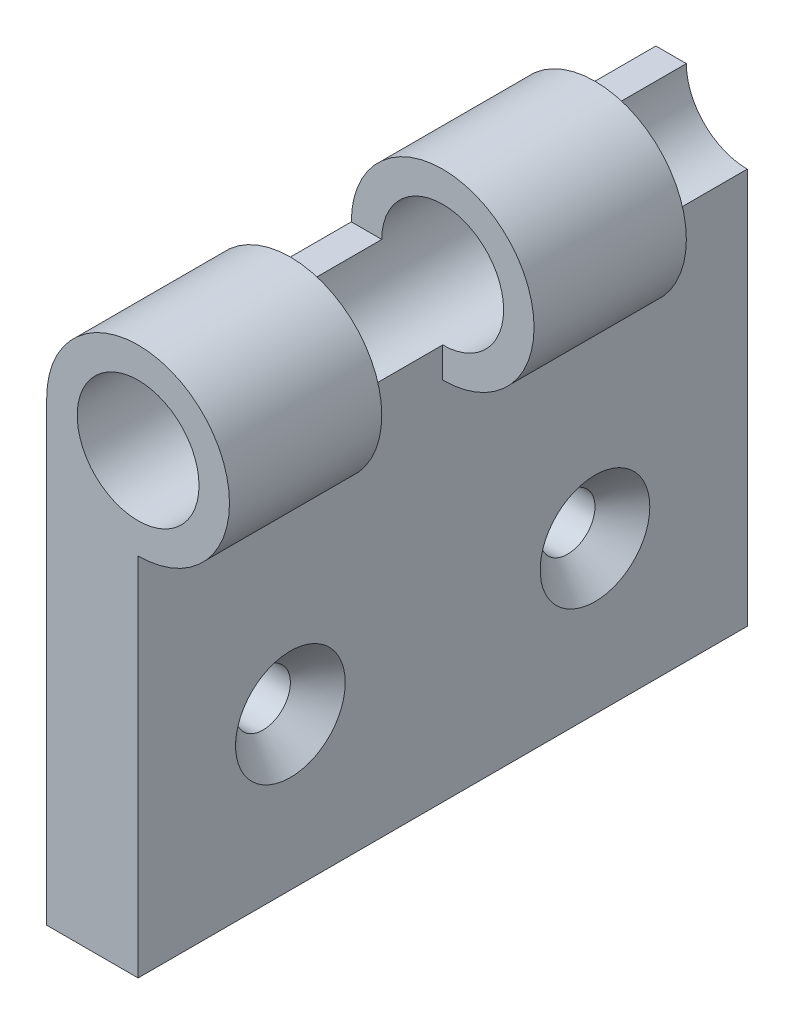
ISO-10303-21;
HEADER;
FILE_DESCRIPTION(('STEP AP214'),'2;1');
FILE_NAME('part.step','',(''),(''),'','','');
FILE_SCHEMA(('AUTOMOTIVE_DESIGN { 1 0 10303 214 1 1 1 1 }'));
ENDSEC;
DATA;
#1=APPLICATION_CONTEXT('core data for automotive mechanical design processes');
#2=APPLICATION_PROTOCOL_DEFINITION('international standard','automotive_design',2000,#1);
#3=PRODUCT_CONTEXT('',#1,'mechanical');
#4=PRODUCT('Part','Part','',(#3));
#5=PRODUCT_RELATED_PRODUCT_CATEGORY('part','',(#4));
#6=PRODUCT_DEFINITION_FORMATION('','',#4);
#7=PRODUCT_DEFINITION_CONTEXT('part definition',#1,'design');
#8=PRODUCT_DEFINITION('design','',#6,#7);
#9=PRODUCT_DEFINITION_SHAPE('','',#8);
#10=(LENGTH_UNIT() NAMED_UNIT(*) SI_UNIT(.MILLI.,.METRE.));
#11=(NAMED_UNIT(*) PLANE_ANGLE_UNIT() SI_UNIT($,.RADIAN.));
#12=(NAMED_UNIT(*) SI_UNIT($,.STERADIAN.) SOLID_ANGLE_UNIT());
#13=UNCERTAINTY_MEASURE_WITH_UNIT(LENGTH_MEASURE(1.E-05),#10,'distance_accuracy_value','');
#14=(GEOMETRIC_REPRESENTATION_CONTEXT(3) GLOBAL_UNCERTAINTY_ASSIGNED_CONTEXT((#13)) GLOBAL_UNIT_ASSIGNED_CONTEXT((#10,
#11,#12)) REPRESENTATION_CONTEXT('',''));
#15=CARTESIAN_POINT('',(0.,0.,0.));
#16=DIRECTION('',(0.,0.,1.));
#17=DIRECTION('',(1.,0.,0.));
#18=AXIS2_PLACEMENT_3D('',#15,#16,#17);
#19=CARTESIAN_POINT('',(0.,0.,-20.));
#20=DIRECTION('',(0.,1.,0.));
#21=DIRECTION('',(0.,0.,1.));
#22=AXIS2_PLACEMENT_3D('',#19,#20,#21);
#23=PLANE('',#22);
#24=DIRECTION('',(0.,0.,1.));
#25=VECTOR('',#24,1.);
#26=CARTESIAN_POINT('',(0.999999999999999,0.,-20.));
#27=LINE('',#26,#25);
#28=CARTESIAN_POINT('',(0.999999999999999,0.,-20.));
#29=VERTEX_POINT('',#28);
#30=CARTESIAN_POINT('',(0.999999999999999,0.,-15.));
#31=VERTEX_POINT('',#30);
#32=EDGE_CURVE('E48',#29,#31,#27,.T.);
#33=ORIENTED_EDGE('',*,*,#32,.F.);
#34=DIRECTION('',(-1.,0.,0.));
#35=VECTOR('',#34,1.);
#36=CARTESIAN_POINT('',(0.,0.,-20.));
#37=LINE('',#36,#35);
#38=CARTESIAN_POINT('',(0.,0.,-20.));
#39=VERTEX_POINT('',#38);
#40=EDGE_CURVE('E124',#29,#39,#37,.T.);
#41=ORIENTED_EDGE('',*,*,#40,.T.);
#42=DIRECTION('',(0.,0.,1.));
#43=VECTOR('',#42,1.);
#44=CARTESIAN_POINT('',(0.,0.,-20.));
#45=LINE('',#44,#43);
#46=CARTESIAN_POINT('',(0.,0.,-15.));
#47=VERTEX_POINT('',#46);
#48=EDGE_CURVE('E154',#39,#47,#45,.T.);
#49=ORIENTED_EDGE('',*,*,#48,.T.);
#50=DIRECTION('',(1.,0.,0.));
#51=VECTOR('',#50,1.);
#52=CARTESIAN_POINT('',(0.,0.,-15.));
#53=LINE('',#52,#51);
#54=EDGE_CURVE('E127',#47,#31,#53,.T.);
#55=ORIENTED_EDGE('',*,*,#54,.T.);
#56=EDGE_LOOP('',(#33,#41,#49,#55));
#57=FACE_BOUND('',#56,.T.);
#58=ADVANCED_FACE('F33',(#57),#23,.T.);
#59=CARTESIAN_POINT('',(3.,0.,-20.));
#60=DIRECTION('',(1.,0.,0.));
#61=DIRECTION('',(0.,1.,0.));
#62=AXIS2_PLACEMENT_3D('',#59,#60,#61);
#63=PLANE('',#62);
#64=CARTESIAN_POINT('',(3.,-10.,-5.));
#65=DIRECTION('',(1.,0.,0.));
#66=DIRECTION('',(0.,0.,-1.));
#67=AXIS2_PLACEMENT_3D('',#64,#65,#66);
#68=CIRCLE('',#67,1.8);
#69=CARTESIAN_POINT('',(3.,-10.,-6.8));
#70=VERTEX_POINT('',#69);
#71=EDGE_CURVE('E273',#70,#70,#68,.T.);
#72=ORIENTED_EDGE('',*,*,#71,.F.);
#73=EDGE_LOOP('',(#72));
#74=FACE_BOUND('',#73,.T.);
#75=CARTESIAN_POINT('',(3.,-10.,-15.));
#76=DIRECTION('',(1.,0.,0.));
#77=DIRECTION('',(0.,0.,-1.));
#78=AXIS2_PLACEMENT_3D('',#75,#76,#77);
#79=CIRCLE('',#78,1.8);
#80=CARTESIAN_POINT('',(3.,-10.,-16.8));
#81=VERTEX_POINT('',#80);
#82=EDGE_CURVE('E264',#81,#81,#79,.T.);
#83=ORIENTED_EDGE('',*,*,#82,.F.);
#84=EDGE_LOOP('',(#83));
#85=FACE_BOUND('',#84,.T.);
#86=DIRECTION('',(0.,0.,1.));
#87=VECTOR('',#86,1.);
#88=CARTESIAN_POINT('',(3.,-2.,-20.));
#89=LINE('',#88,#87);
#90=CARTESIAN_POINT('',(3.,-2.,-5.));
#91=VERTEX_POINT('',#90);
#92=CARTESIAN_POINT('',(3.,-2.,-10.));
#93=VERTEX_POINT('',#92);
#94=EDGE_CURVE('E55',#91,#93,#89,.F.);
#95=ORIENTED_EDGE('',*,*,#94,.F.);
#96=DIRECTION('',(0.,-1.,0.));
#97=VECTOR('',#96,1.);
#98=CARTESIAN_POINT('',(3.,0.,-5.));
#99=LINE('',#98,#97);
#100=CARTESIAN_POINT('',(3.,-3.,-5.));
#101=VERTEX_POINT('',#100);
#102=EDGE_CURVE('E156',#91,#101,#99,.T.);
#103=ORIENTED_EDGE('',*,*,#102,.T.);
#104=DIRECTION('',(0.,0.,1.));
#105=VECTOR('',#104,1.);
#106=CARTESIAN_POINT('',(3.,-3.,-5.));
#107=LINE('',#106,#105);
#108=CARTESIAN_POINT('',(3.,-3.,0.));
#109=VERTEX_POINT('',#108);
#110=EDGE_CURVE('E194',#109,#101,#107,.F.);
#111=ORIENTED_EDGE('',*,*,#110,.F.);
#112=DIRECTION('',(0.,1.,0.));
#113=VECTOR('',#112,1.);
#114=CARTESIAN_POINT('',(3.,0.,0.));
#115=LINE('',#114,#113);
#116=CARTESIAN_POINT('',(3.,-15.,0.));
#117=VERTEX_POINT('',#116);
#118=EDGE_CURVE('E151',#117,#109,#115,.T.);
#119=ORIENTED_EDGE('',*,*,#118,.F.);
#120=DIRECTION('',(0.,0.,1.));
#121=VECTOR('',#120,1.);
#122=CARTESIAN_POINT('',(3.,-15.,-20.));
#123=LINE('',#122,#121);
#124=CARTESIAN_POINT('',(3.,-15.,-20.));
#125=VERTEX_POINT('',#124);
#126=EDGE_CURVE('E138',#125,#117,#123,.T.);
#127=ORIENTED_EDGE('',*,*,#126,.F.);
#128=DIRECTION('',(0.,1.,0.));
#129=VECTOR('',#128,1.);
#130=CARTESIAN_POINT('',(3.,0.,-20.));
#131=LINE('',#130,#129);
#132=CARTESIAN_POINT('',(3.,-2.,-20.));
#133=VERTEX_POINT('',#132);
#134=EDGE_CURVE('E136',#125,#133,#131,.T.);
#135=ORIENTED_EDGE('',*,*,#134,.T.);
#136=CARTESIAN_POINT('',(3.,-2.,-15.));
#137=VERTEX_POINT('',#136);
#138=EDGE_CURVE('E113',#137,#133,#89,.F.);
#139=ORIENTED_EDGE('',*,*,#138,.F.);
#140=DIRECTION('',(0.,-1.,0.));
#141=VECTOR('',#140,1.);
#142=CARTESIAN_POINT('',(3.,0.,-15.));
#143=LINE('',#142,#141);
#144=CARTESIAN_POINT('',(3.,-3.,-15.));
#145=VERTEX_POINT('',#144);
#146=EDGE_CURVE('E41',#137,#145,#143,.T.);
#147=ORIENTED_EDGE('',*,*,#146,.T.);
#148=DIRECTION('',(0.,0.,1.));
#149=VECTOR('',#148,1.);
#150=CARTESIAN_POINT('',(3.,-3.,-15.));
#151=LINE('',#150,#149);
#152=CARTESIAN_POINT('',(3.,-3.,-10.));
#153=VERTEX_POINT('',#152);
#154=EDGE_CURVE('E162',#153,#145,#151,.F.);
#155=ORIENTED_EDGE('',*,*,#154,.F.);
#156=DIRECTION('',(0.,-1.,0.));
#157=VECTOR('',#156,1.);
#158=CARTESIAN_POINT('',(3.,0.,-10.));
#159=LINE('',#158,#157);
#160=EDGE_CURVE('E160',#93,#153,#159,.T.);
#161=ORIENTED_EDGE('',*,*,#160,.F.);
#162=EDGE_LOOP('',(#95,#103,#111,#119,#127,#135,#139,#147,#155,#161));
#163=FACE_BOUND('',#162,.T.);
#164=ADVANCED_FACE('F167',(#74,#85,#163),#63,.T.);
#165=DIRECTION('',(0.,0.,1.));
#166=VECTOR('',#165,1.);
#167=CARTESIAN_POINT('',(0.999999999999999,0.,-20.));
#168=LINE('',#167,#166);
#169=CARTESIAN_POINT('',(0.999999999999999,0.,-10.));
#170=VERTEX_POINT('',#169);
#171=CARTESIAN_POINT('',(0.999999999999999,0.,-5.));
#172=VERTEX_POINT('',#171);
#173=EDGE_CURVE('E118',#170,#172,#168,.T.);
#174=ORIENTED_EDGE('',*,*,#173,.F.);
#175=DIRECTION('',(1.,0.,0.));
#176=VECTOR('',#175,1.);
#177=CARTESIAN_POINT('',(0.,0.,-10.));
#178=LINE('',#177,#176);
#179=CARTESIAN_POINT('',(0.,0.,-10.));
#180=VERTEX_POINT('',#179);
#181=EDGE_CURVE('E180',#180,#170,#178,.T.);
#182=ORIENTED_EDGE('',*,*,#181,.F.);
#183=CARTESIAN_POINT('',(0.,0.,-5.));
#184=VERTEX_POINT('',#183);
#185=EDGE_CURVE('E157',#180,#184,#45,.T.);
#186=ORIENTED_EDGE('',*,*,#185,.T.);
#187=DIRECTION('',(1.,0.,0.));
#188=VECTOR('',#187,1.);
#189=CARTESIAN_POINT('',(0.,0.,-5.));
#190=LINE('',#189,#188);
#191=EDGE_CURVE('E148',#184,#172,#190,.T.);
#192=ORIENTED_EDGE('',*,*,#191,.T.);
#193=EDGE_LOOP('',(#174,#182,#186,#192));
#194=FACE_BOUND('',#193,.T.);
#195=ADVANCED_FACE('F239',(#194),#23,.T.);
#196=CARTESIAN_POINT('',(0.,0.,-20.));
#197=DIRECTION('',(-1.,0.,0.));
#198=DIRECTION('',(0.,-1.,0.));
#199=AXIS2_PLACEMENT_3D('',#196,#197,#198);
#200=PLANE('',#199);
#201=CARTESIAN_POINT('',(0.,-10.,-5.));
#202=DIRECTION('',(1.,0.,0.));
#203=DIRECTION('',(0.,0.,-1.));
#204=AXIS2_PLACEMENT_3D('',#201,#202,#203);
#205=CIRCLE('',#204,0.9);
#206=CARTESIAN_POINT('',(0.,-10.,-5.9));
#207=VERTEX_POINT('',#206);
#208=EDGE_CURVE('E267',#207,#207,#205,.T.);
#209=ORIENTED_EDGE('',*,*,#208,.T.);
#210=EDGE_LOOP('',(#209));
#211=FACE_BOUND('',#210,.T.);
#212=CARTESIAN_POINT('',(0.,-10.,-15.));
#213=DIRECTION('',(1.,0.,0.));
#214=DIRECTION('',(0.,0.,-1.));
#215=AXIS2_PLACEMENT_3D('',#212,#213,#214);
#216=CIRCLE('',#215,0.9);
#217=CARTESIAN_POINT('',(0.,-10.,-15.9));
#218=VERTEX_POINT('',#217);
#219=EDGE_CURVE('E119',#218,#218,#216,.T.);
#220=ORIENTED_EDGE('',*,*,#219,.T.);
#221=EDGE_LOOP('',(#220));
#222=FACE_BOUND('',#221,.T.);
#223=DIRECTION('',(0.,-1.,0.));
#224=VECTOR('',#223,1.);
#225=CARTESIAN_POINT('',(0.,0.,0.));
#226=LINE('',#225,#224);
#227=CARTESIAN_POINT('',(0.,0.,0.));
#228=VERTEX_POINT('',#227);
#229=CARTESIAN_POINT('',(0.,-15.,0.));
#230=VERTEX_POINT('',#229);
#231=EDGE_CURVE('E144',#228,#230,#226,.T.);
#232=ORIENTED_EDGE('',*,*,#231,.F.);
#233=DIRECTION('',(0.,0.,1.));
#234=VECTOR('',#233,1.);
#235=CARTESIAN_POINT('',(0.,0.,-5.));
#236=LINE('',#235,#234);
#237=EDGE_CURVE('E199',#184,#228,#236,.T.);
#238=ORIENTED_EDGE('',*,*,#237,.F.);
#239=ORIENTED_EDGE('',*,*,#185,.F.);
#240=DIRECTION('',(0.,0.,1.));
#241=VECTOR('',#240,1.);
#242=CARTESIAN_POINT('',(0.,0.,-15.));
#243=LINE('',#242,#241);
#244=EDGE_CURVE('E188',#47,#180,#243,.T.);
#245=ORIENTED_EDGE('',*,*,#244,.F.);
#246=ORIENTED_EDGE('',*,*,#48,.F.);
#247=DIRECTION('',(0.,-1.,0.));
#248=VECTOR('',#247,1.);
#249=CARTESIAN_POINT('',(0.,0.,-20.));
#250=LINE('',#249,#248);
#251=CARTESIAN_POINT('',(0.,-15.,-20.));
#252=VERTEX_POINT('',#251);
#253=EDGE_CURVE('E134',#39,#252,#250,.T.);
#254=ORIENTED_EDGE('',*,*,#253,.T.);
#255=DIRECTION('',(0.,0.,1.));
#256=VECTOR('',#255,1.);
#257=CARTESIAN_POINT('',(0.,-15.,-20.));
#258=LINE('',#257,#256);
#259=EDGE_CURVE('E135',#252,#230,#258,.T.);
#260=ORIENTED_EDGE('',*,*,#259,.T.);
#261=EDGE_LOOP('',(#232,#238,#239,#245,#246,#254,#260));
#262=FACE_BOUND('',#261,.T.);
#263=ADVANCED_FACE('F35',(#211,#222,#262),#200,.T.);
#264=CARTESIAN_POINT('',(0.,-15.,-20.));
#265=DIRECTION('',(0.,-1.,0.));
#266=DIRECTION('',(0.,0.,-1.));
#267=AXIS2_PLACEMENT_3D('',#264,#265,#266);
#268=PLANE('',#267);
#269=DIRECTION('',(1.,0.,0.));
#270=VECTOR('',#269,1.);
#271=CARTESIAN_POINT('',(0.,-15.,0.));
#272=LINE('',#271,#270);
#273=EDGE_CURVE('E147',#230,#117,#272,.T.);
#274=ORIENTED_EDGE('',*,*,#273,.F.);
#275=ORIENTED_EDGE('',*,*,#259,.F.);
#276=DIRECTION('',(1.,0.,0.));
#277=VECTOR('',#276,1.);
#278=CARTESIAN_POINT('',(0.,-15.,-20.));
#279=LINE('',#278,#277);
#280=EDGE_CURVE('E140',#252,#125,#279,.T.);
#281=ORIENTED_EDGE('',*,*,#280,.T.);
#282=ORIENTED_EDGE('',*,*,#126,.T.);
#283=EDGE_LOOP('',(#274,#275,#281,#282));
#284=FACE_BOUND('',#283,.T.);
#285=ADVANCED_FACE('F206',(#284),#268,.T.);
#286=CARTESIAN_POINT('',(0.,0.,-20.));
#287=DIRECTION('',(0.,0.,1.));
#288=DIRECTION('',(1.,0.,0.));
#289=AXIS2_PLACEMENT_3D('',#286,#287,#288);
#290=PLANE('',#289);
#291=ORIENTED_EDGE('',*,*,#40,.F.);
#292=CARTESIAN_POINT('',(3.,0.,-20.));
#293=DIRECTION('',(0.,0.,1.));
#294=DIRECTION('',(1.,0.,0.));
#295=AXIS2_PLACEMENT_3D('',#292,#293,#294);
#296=CIRCLE('',#295,2.);
#297=EDGE_CURVE('E110',#29,#133,#296,.T.);
#298=ORIENTED_EDGE('',*,*,#297,.T.);
#299=ORIENTED_EDGE('',*,*,#134,.F.);
#300=ORIENTED_EDGE('',*,*,#280,.F.);
#301=ORIENTED_EDGE('',*,*,#253,.F.);
#302=EDGE_LOOP('',(#291,#298,#299,#300,#301));
#303=FACE_BOUND('',#302,.T.);
#304=ADVANCED_FACE('F131',(#303),#290,.F.);
#305=CARTESIAN_POINT('',(0.,0.,0.));
#306=DIRECTION('',(0.,0.,1.));
#307=DIRECTION('',(1.,0.,0.));
#308=AXIS2_PLACEMENT_3D('',#305,#306,#307);
#309=PLANE('',#308);
#310=CARTESIAN_POINT('',(3.,0.,0.));
#311=DIRECTION('',(0.,0.,1.));
#312=DIRECTION('',(1.,0.,0.));
#313=AXIS2_PLACEMENT_3D('',#310,#311,#312);
#314=CIRCLE('',#313,2.);
#315=CARTESIAN_POINT('',(5.,0.,0.));
#316=VERTEX_POINT('',#315);
#317=EDGE_CURVE('E128',#316,#316,#314,.T.);
#318=ORIENTED_EDGE('',*,*,#317,.F.);
#319=EDGE_LOOP('',(#318));
#320=FACE_BOUND('',#319,.T.);
#321=CARTESIAN_POINT('',(3.,0.,0.));
#322=DIRECTION('',(0.,0.,1.));
#323=DIRECTION('',(1.,0.,0.));
#324=AXIS2_PLACEMENT_3D('',#321,#322,#323);
#325=CIRCLE('',#324,3.);
#326=EDGE_CURVE('E190',#109,#228,#325,.T.);
#327=ORIENTED_EDGE('',*,*,#326,.T.);
#328=ORIENTED_EDGE('',*,*,#231,.T.);
#329=ORIENTED_EDGE('',*,*,#273,.T.);
#330=ORIENTED_EDGE('',*,*,#118,.T.);
#331=EDGE_LOOP('',(#327,#328,#329,#330));
#332=FACE_BOUND('',#331,.T.);
#333=ADVANCED_FACE('F226',(#320,#332),#309,.T.);
#334=CARTESIAN_POINT('',(3.,0.,-5.));
#335=DIRECTION('',(0.,0.,1.));
#336=DIRECTION('',(1.,0.,0.));
#337=AXIS2_PLACEMENT_3D('',#334,#335,#336);
#338=CYLINDRICAL_SURFACE('',#337,3.);
#339=CARTESIAN_POINT('',(3.,0.,-5.));
#340=DIRECTION('',(0.,0.,1.));
#341=DIRECTION('',(1.,0.,0.));
#342=AXIS2_PLACEMENT_3D('',#339,#340,#341);
#343=CIRCLE('',#342,3.);
#344=EDGE_CURVE('E191',#101,#184,#343,.T.);
#345=ORIENTED_EDGE('',*,*,#344,.T.);
#346=ORIENTED_EDGE('',*,*,#237,.T.);
#347=ORIENTED_EDGE('',*,*,#326,.F.);
#348=ORIENTED_EDGE('',*,*,#110,.T.);
#349=EDGE_LOOP('',(#345,#346,#347,#348));
#350=FACE_BOUND('',#349,.T.);
#351=ADVANCED_FACE('F224',(#350),#338,.T.);
#352=CARTESIAN_POINT('',(3.,0.,-5.));
#353=DIRECTION('',(0.,0.,1.));
#354=DIRECTION('',(1.,0.,0.));
#355=AXIS2_PLACEMENT_3D('',#352,#353,#354);
#356=PLANE('',#355);
#357=ORIENTED_EDGE('',*,*,#102,.F.);
#358=CARTESIAN_POINT('',(3.,0.,-5.));
#359=DIRECTION('',(0.,0.,1.));
#360=DIRECTION('',(1.,0.,0.));
#361=AXIS2_PLACEMENT_3D('',#358,#359,#360);
#362=CIRCLE('',#361,2.);
#363=EDGE_CURVE('E216',#91,#172,#362,.T.);
#364=ORIENTED_EDGE('',*,*,#363,.T.);
#365=ORIENTED_EDGE('',*,*,#191,.F.);
#366=ORIENTED_EDGE('',*,*,#344,.F.);
#367=EDGE_LOOP('',(#357,#364,#365,#366));
#368=FACE_BOUND('',#367,.T.);
#369=ADVANCED_FACE('F221',(#368),#356,.F.);
#370=CARTESIAN_POINT('',(3.,0.,-15.));
#371=DIRECTION('',(0.,0.,1.));
#372=DIRECTION('',(1.,0.,0.));
#373=AXIS2_PLACEMENT_3D('',#370,#371,#372);
#374=CYLINDRICAL_SURFACE('',#373,3.);
#375=CARTESIAN_POINT('',(3.,0.,-15.));
#376=DIRECTION('',(0.,0.,1.));
#377=DIRECTION('',(1.,0.,0.));
#378=AXIS2_PLACEMENT_3D('',#375,#376,#377);
#379=CIRCLE('',#378,3.);
#380=EDGE_CURVE('E176',#145,#47,#379,.T.);
#381=ORIENTED_EDGE('',*,*,#380,.T.);
#382=ORIENTED_EDGE('',*,*,#244,.T.);
#383=CARTESIAN_POINT('',(3.,0.,-10.));
#384=DIRECTION('',(0.,0.,1.));
#385=DIRECTION('',(1.,0.,0.));
#386=AXIS2_PLACEMENT_3D('',#383,#384,#385);
#387=CIRCLE('',#386,3.);
#388=EDGE_CURVE('E178',#153,#180,#387,.T.);
#389=ORIENTED_EDGE('',*,*,#388,.F.);
#390=ORIENTED_EDGE('',*,*,#154,.T.);
#391=EDGE_LOOP('',(#381,#382,#389,#390));
#392=FACE_BOUND('',#391,.T.);
#393=ADVANCED_FACE('F174',(#392),#374,.T.);
#394=CARTESIAN_POINT('',(3.,0.,-15.));
#395=DIRECTION('',(0.,0.,1.));
#396=DIRECTION('',(1.,0.,0.));
#397=AXIS2_PLACEMENT_3D('',#394,#395,#396);
#398=PLANE('',#397);
#399=ORIENTED_EDGE('',*,*,#146,.F.);
#400=CARTESIAN_POINT('',(3.,0.,-15.));
#401=DIRECTION('',(0.,0.,1.));
#402=DIRECTION('',(1.,0.,0.));
#403=AXIS2_PLACEMENT_3D('',#400,#401,#402);
#404=CIRCLE('',#403,2.);
#405=EDGE_CURVE('E258',#137,#31,#404,.T.);
#406=ORIENTED_EDGE('',*,*,#405,.T.);
#407=ORIENTED_EDGE('',*,*,#54,.F.);
#408=ORIENTED_EDGE('',*,*,#380,.F.);
#409=EDGE_LOOP('',(#399,#406,#407,#408));
#410=FACE_BOUND('',#409,.T.);
#411=ADVANCED_FACE('F179',(#410),#398,.F.);
#412=CARTESIAN_POINT('',(3.,0.,-10.));
#413=DIRECTION('',(0.,0.,1.));
#414=DIRECTION('',(1.,0.,0.));
#415=AXIS2_PLACEMENT_3D('',#412,#413,#414);
#416=PLANE('',#415);
#417=CARTESIAN_POINT('',(3.,0.,-10.));
#418=DIRECTION('',(0.,0.,1.));
#419=DIRECTION('',(1.,0.,0.));
#420=AXIS2_PLACEMENT_3D('',#417,#418,#419);
#421=CIRCLE('',#420,2.);
#422=EDGE_CURVE('E11',#93,#170,#421,.T.);
#423=ORIENTED_EDGE('',*,*,#422,.F.);
#424=ORIENTED_EDGE('',*,*,#160,.T.);
#425=ORIENTED_EDGE('',*,*,#388,.T.);
#426=ORIENTED_EDGE('',*,*,#181,.T.);
#427=EDGE_LOOP('',(#423,#424,#425,#426));
#428=FACE_BOUND('',#427,.T.);
#429=ADVANCED_FACE('F213',(#428),#416,.T.);
#430=CARTESIAN_POINT('',(3.,0.,-20.));
#431=DIRECTION('',(0.,0.,1.));
#432=DIRECTION('',(1.,0.,0.));
#433=AXIS2_PLACEMENT_3D('',#430,#431,#432);
#434=CYLINDRICAL_SURFACE('',#433,2.);
#435=ORIENTED_EDGE('',*,*,#317,.T.);
#436=EDGE_LOOP('',(#435));
#437=FACE_BOUND('',#436,.T.);
#438=ORIENTED_EDGE('',*,*,#32,.T.);
#439=ORIENTED_EDGE('',*,*,#405,.F.);
#440=ORIENTED_EDGE('',*,*,#138,.T.);
#441=ORIENTED_EDGE('',*,*,#297,.F.);
#442=EDGE_LOOP('',(#438,#439,#440,#441));
#443=FACE_BOUND('',#442,.T.);
#444=ORIENTED_EDGE('',*,*,#94,.T.);
#445=ORIENTED_EDGE('',*,*,#422,.T.);
#446=ORIENTED_EDGE('',*,*,#173,.T.);
#447=ORIENTED_EDGE('',*,*,#363,.F.);
#448=EDGE_LOOP('',(#444,#445,#446,#447));
#449=FACE_BOUND('',#448,.T.);
#450=ADVANCED_FACE('F111',(#437,#443,#449),#434,.F.);
#451=CARTESIAN_POINT('',(3.,-10.,-15.));
#452=DIRECTION('',(1.,0.,0.));
#453=DIRECTION('',(0.,0.,-1.));
#454=AXIS2_PLACEMENT_3D('',#451,#452,#453);
#455=CYLINDRICAL_SURFACE('',#454,0.9);
#456=ORIENTED_EDGE('',*,*,#219,.F.);
#457=EDGE_LOOP('',(#456));
#458=FACE_BOUND('',#457,.T.);
#459=CARTESIAN_POINT('',(2.1,-10.,-15.));
#460=DIRECTION('',(1.,0.,0.));
#461=DIRECTION('',(0.,0.,-1.));
#462=AXIS2_PLACEMENT_3D('',#459,#460,#461);
#463=CIRCLE('',#462,0.9);
#464=CARTESIAN_POINT('',(2.1,-10.,-15.9));
#465=VERTEX_POINT('',#464);
#466=EDGE_CURVE('E261',#465,#465,#463,.T.);
#467=ORIENTED_EDGE('',*,*,#466,.T.);
#468=EDGE_LOOP('',(#467));
#469=FACE_BOUND('',#468,.T.);
#470=ADVANCED_FACE('F284',(#458,#469),#455,.F.);
#471=CARTESIAN_POINT('',(3.,-10.,-15.));
#472=DIRECTION('',(1.,0.,0.));
#473=DIRECTION('',(0.,0.,-1.));
#474=AXIS2_PLACEMENT_3D('',#471,#472,#473);
#475=CONICAL_SURFACE('',#474,1.8,0.785398163397447);
#476=ORIENTED_EDGE('',*,*,#466,.F.);
#477=EDGE_LOOP('',(#476));
#478=FACE_BOUND('',#477,.T.);
#479=ORIENTED_EDGE('',*,*,#82,.T.);
#480=EDGE_LOOP('',(#479));
#481=FACE_BOUND('',#480,.T.);
#482=ADVANCED_FACE('F281',(#478,#481),#475,.F.);
#483=CARTESIAN_POINT('',(3.,-10.,-5.));
#484=DIRECTION('',(1.,0.,0.));
#485=DIRECTION('',(0.,0.,-1.));
#486=AXIS2_PLACEMENT_3D('',#483,#484,#485);
#487=CYLINDRICAL_SURFACE('',#486,0.9);
#488=ORIENTED_EDGE('',*,*,#208,.F.);
#489=EDGE_LOOP('',(#488));
#490=FACE_BOUND('',#489,.T.);
#491=CARTESIAN_POINT('',(2.1,-10.,-5.));
#492=DIRECTION('',(1.,0.,0.));
#493=DIRECTION('',(0.,0.,-1.));
#494=AXIS2_PLACEMENT_3D('',#491,#492,#493);
#495=CIRCLE('',#494,0.9);
#496=CARTESIAN_POINT('',(2.1,-10.,-5.9));
#497=VERTEX_POINT('',#496);
#498=EDGE_CURVE('E270',#497,#497,#495,.T.);
#499=ORIENTED_EDGE('',*,*,#498,.T.);
#500=EDGE_LOOP('',(#499));
#501=FACE_BOUND('',#500,.T.);
#502=ADVANCED_FACE('F283',(#490,#501),#487,.F.);
#503=CARTESIAN_POINT('',(3.,-10.,-5.));
#504=DIRECTION('',(1.,0.,0.));
#505=DIRECTION('',(0.,0.,-1.));
#506=AXIS2_PLACEMENT_3D('',#503,#504,#505);
#507=CONICAL_SURFACE('',#506,1.8,0.785398163397447);
#508=ORIENTED_EDGE('',*,*,#498,.F.);
#509=EDGE_LOOP('',(#508));
#510=FACE_BOUND('',#509,.T.);
#511=ORIENTED_EDGE('',*,*,#71,.T.);
#512=EDGE_LOOP('',(#511));
#513=FACE_BOUND('',#512,.T.);
#514=ADVANCED_FACE('F277',(#510,#513),#507,.F.);
#515=CLOSED_SHELL('',(#58,#164,#195,#263,#285,#304,#333,#351,#369,#393,#411,#429,#450,#470,#482,
#502,#514));
#516=MANIFOLD_SOLID_BREP('B2',#515);
#517=ADVANCED_BREP_SHAPE_REPRESENTATION('',(#18,#516),#14);
#518=SHAPE_DEFINITION_REPRESENTATION(#9,#517);
ENDSEC;
END-ISO-10303-21;
